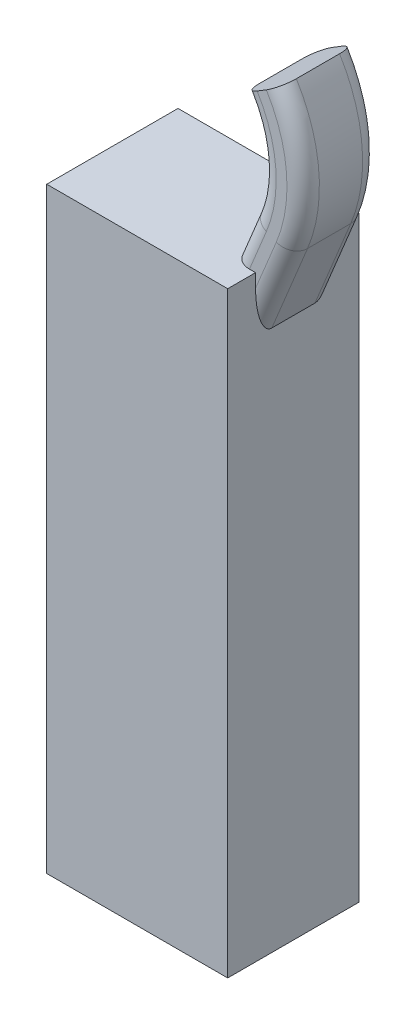
ISO-10303-21;
HEADER;
FILE_DESCRIPTION(('STEP AP214'),'2;1');
FILE_NAME('part.step','',(''),(''),'','','');
FILE_SCHEMA(('AUTOMOTIVE_DESIGN { 1 0 10303 214 1 1 1 1 }'));
ENDSEC;
DATA;
#1=APPLICATION_CONTEXT('core data for automotive mechanical design processes');
#2=APPLICATION_PROTOCOL_DEFINITION('international standard','automotive_design',2000,#1);
#3=PRODUCT_CONTEXT('',#1,'mechanical');
#4=PRODUCT('Part','Part','',(#3));
#5=PRODUCT_RELATED_PRODUCT_CATEGORY('part','',(#4));
#6=PRODUCT_DEFINITION_FORMATION('','',#4);
#7=PRODUCT_DEFINITION_CONTEXT('part definition',#1,'design');
#8=PRODUCT_DEFINITION('design','',#6,#7);
#9=PRODUCT_DEFINITION_SHAPE('','',#8);
#10=(LENGTH_UNIT() NAMED_UNIT(*) SI_UNIT(.MILLI.,.METRE.));
#11=(NAMED_UNIT(*) PLANE_ANGLE_UNIT() SI_UNIT($,.RADIAN.));
#12=(NAMED_UNIT(*) SI_UNIT($,.STERADIAN.) SOLID_ANGLE_UNIT());
#13=UNCERTAINTY_MEASURE_WITH_UNIT(LENGTH_MEASURE(1.E-05),#10,'distance_accuracy_value','');
#14=(GEOMETRIC_REPRESENTATION_CONTEXT(3) GLOBAL_UNCERTAINTY_ASSIGNED_CONTEXT((#13)) GLOBAL_UNIT_ASSIGNED_CONTEXT((#10,
#11,#12)) REPRESENTATION_CONTEXT('',''));
#15=CARTESIAN_POINT('',(0.,0.,0.));
#16=DIRECTION('',(0.,0.,1.));
#17=DIRECTION('',(1.,0.,0.));
#18=AXIS2_PLACEMENT_3D('',#15,#16,#17);
#19=CARTESIAN_POINT('',(16.75,-55.25,12.15));
#20=DIRECTION('',(-1.,0.,0.));
#21=DIRECTION('',(0.,0.,1.));
#22=AXIS2_PLACEMENT_3D('',#19,#20,#21);
#23=PLANE('',#22);
#24=DIRECTION('',(0.,0.,-1.));
#25=VECTOR('',#24,1.);
#26=CARTESIAN_POINT('',(16.75,44.8673503761289,12.15));
#27=LINE('',#26,#25);
#28=CARTESIAN_POINT('',(16.75,44.8673503761289,4.));
#29=VERTEX_POINT('',#28);
#30=CARTESIAN_POINT('',(16.75,44.8673503761289,-4.));
#31=VERTEX_POINT('',#30);
#32=EDGE_CURVE('E200',#29,#31,#27,.T.);
#33=ORIENTED_EDGE('',*,*,#32,.F.);
#34=CARTESIAN_POINT('',(16.75,52.7331085884756,4.));
#35=DIRECTION('',(-1.,0.,0.));
#36=DIRECTION('',(0.,-1.,0.));
#37=AXIS2_PLACEMENT_3D('',#34,#35,#36);
#38=ELLIPSE('',#37,7.86575821234668,3.);
#39=CARTESIAN_POINT('',(16.75,52.7331085884756,7.));
#40=VERTEX_POINT('',#39);
#41=EDGE_CURVE('E247',#29,#40,#38,.T.);
#42=ORIENTED_EDGE('',*,*,#41,.T.);
#43=DIRECTION('',(0.,1.,0.));
#44=VECTOR('',#43,1.);
#45=CARTESIAN_POINT('',(16.75,-55.25,7.));
#46=LINE('',#45,#44);
#47=CARTESIAN_POINT('',(16.75,55.25,7.));
#48=VERTEX_POINT('',#47);
#49=EDGE_CURVE('E186',#40,#48,#46,.T.);
#50=ORIENTED_EDGE('',*,*,#49,.T.);
#51=DIRECTION('',(0.,0.,-1.));
#52=VECTOR('',#51,1.);
#53=CARTESIAN_POINT('',(16.75,55.25,12.15));
#54=LINE('',#53,#52);
#55=CARTESIAN_POINT('',(16.75,55.25,12.15));
#56=VERTEX_POINT('',#55);
#57=EDGE_CURVE('E166',#56,#48,#54,.T.);
#58=ORIENTED_EDGE('',*,*,#57,.F.);
#59=DIRECTION('',(0.,1.,0.));
#60=VECTOR('',#59,1.);
#61=CARTESIAN_POINT('',(16.75,-55.25,12.15));
#62=LINE('',#61,#60);
#63=CARTESIAN_POINT('',(16.75,-55.25,12.15));
#64=VERTEX_POINT('',#63);
#65=EDGE_CURVE('E173',#64,#56,#62,.T.);
#66=ORIENTED_EDGE('',*,*,#65,.F.);
#67=DIRECTION('',(0.,0.,-1.));
#68=VECTOR('',#67,1.);
#69=CARTESIAN_POINT('',(16.75,-55.25,12.15));
#70=LINE('',#69,#68);
#71=CARTESIAN_POINT('',(16.75,-55.25,-12.15));
#72=VERTEX_POINT('',#71);
#73=EDGE_CURVE('E294',#64,#72,#70,.T.);
#74=ORIENTED_EDGE('',*,*,#73,.T.);
#75=DIRECTION('',(0.,1.,0.));
#76=VECTOR('',#75,1.);
#77=CARTESIAN_POINT('',(16.75,-55.25,-12.15));
#78=LINE('',#77,#76);
#79=CARTESIAN_POINT('',(16.75,55.25,-12.15));
#80=VERTEX_POINT('',#79);
#81=EDGE_CURVE('E290',#72,#80,#78,.T.);
#82=ORIENTED_EDGE('',*,*,#81,.T.);
#83=CARTESIAN_POINT('',(16.75,55.25,-7.));
#84=VERTEX_POINT('',#83);
#85=EDGE_CURVE('E188',#84,#80,#54,.T.);
#86=ORIENTED_EDGE('',*,*,#85,.F.);
#87=DIRECTION('',(0.,1.,0.));
#88=VECTOR('',#87,1.);
#89=CARTESIAN_POINT('',(16.75,-55.25,-7.));
#90=LINE('',#89,#88);
#91=CARTESIAN_POINT('',(16.75,52.7331085884756,-7.));
#92=VERTEX_POINT('',#91);
#93=EDGE_CURVE('E288',#92,#84,#90,.T.);
#94=ORIENTED_EDGE('',*,*,#93,.F.);
#95=CARTESIAN_POINT('',(16.75,52.7331085884756,-4.));
#96=DIRECTION('',(-1.,0.,0.));
#97=DIRECTION('',(0.,1.,0.));
#98=AXIS2_PLACEMENT_3D('',#95,#96,#97);
#99=ELLIPSE('',#98,7.86575821234668,3.);
#100=EDGE_CURVE('E245',#92,#31,#99,.T.);
#101=ORIENTED_EDGE('',*,*,#100,.T.);
#102=EDGE_LOOP('',(#33,#42,#50,#58,#66,#74,#82,#86,#94,#101));
#103=FACE_BOUND('',#102,.T.);
#104=ADVANCED_FACE('F39',(#103),#23,.F.);
#105=CARTESIAN_POINT('',(-16.75,55.25,12.15));
#106=DIRECTION('',(0.,-1.,0.));
#107=DIRECTION('',(0.,0.,-1.));
#108=AXIS2_PLACEMENT_3D('',#105,#106,#107);
#109=PLANE('',#108);
#110=ORIENTED_EDGE('',*,*,#57,.T.);
#111=DIRECTION('',(-1.,0.,0.));
#112=VECTOR('',#111,1.);
#113=CARTESIAN_POINT('',(-16.75,55.25,7.));
#114=LINE('',#113,#112);
#115=CARTESIAN_POINT('',(15.6248958293308,55.25,7.));
#116=VERTEX_POINT('',#115);
#117=EDGE_CURVE('E198',#48,#116,#114,.T.);
#118=ORIENTED_EDGE('',*,*,#117,.T.);
#119=CARTESIAN_POINT('',(15.6248958293308,55.25,4.));
#120=DIRECTION('',(0.,-1.,0.));
#121=DIRECTION('',(1.,0.,0.));
#122=AXIS2_PLACEMENT_3D('',#119,#120,#121);
#123=ELLIPSE('',#122,3.2453128288703,3.);
#124=CARTESIAN_POINT('',(12.3795830004605,55.25,4.));
#125=VERTEX_POINT('',#124);
#126=EDGE_CURVE('E11',#116,#125,#123,.T.);
#127=ORIENTED_EDGE('',*,*,#126,.T.);
#128=DIRECTION('',(0.,0.,-1.));
#129=VECTOR('',#128,1.);
#130=CARTESIAN_POINT('',(12.3795830004605,55.25,12.15));
#131=LINE('',#130,#129);
#132=CARTESIAN_POINT('',(12.3795830004605,55.25,-4.));
#133=VERTEX_POINT('',#132);
#134=EDGE_CURVE('E191',#125,#133,#131,.T.);
#135=ORIENTED_EDGE('',*,*,#134,.T.);
#136=CARTESIAN_POINT('',(15.6248958293308,55.25,-4.));
#137=DIRECTION('',(0.,-1.,0.));
#138=DIRECTION('',(-1.,0.,0.));
#139=AXIS2_PLACEMENT_3D('',#136,#137,#138);
#140=ELLIPSE('',#139,3.2453128288703,3.);
#141=CARTESIAN_POINT('',(15.6248958293308,55.25,-7.));
#142=VERTEX_POINT('',#141);
#143=EDGE_CURVE('E48',#133,#142,#140,.T.);
#144=ORIENTED_EDGE('',*,*,#143,.T.);
#145=DIRECTION('',(-1.,0.,0.));
#146=VECTOR('',#145,1.);
#147=CARTESIAN_POINT('',(-16.75,55.25,-7.));
#148=LINE('',#147,#146);
#149=EDGE_CURVE('E187',#84,#142,#148,.T.);
#150=ORIENTED_EDGE('',*,*,#149,.F.);
#151=ORIENTED_EDGE('',*,*,#85,.T.);
#152=DIRECTION('',(-1.,0.,0.));
#153=VECTOR('',#152,1.);
#154=CARTESIAN_POINT('',(-16.75,55.25,-12.15));
#155=LINE('',#154,#153);
#156=CARTESIAN_POINT('',(-16.75,55.25,-12.15));
#157=VERTEX_POINT('',#156);
#158=EDGE_CURVE('E297',#80,#157,#155,.T.);
#159=ORIENTED_EDGE('',*,*,#158,.T.);
#160=DIRECTION('',(0.,0.,-1.));
#161=VECTOR('',#160,1.);
#162=CARTESIAN_POINT('',(-16.75,55.25,12.15));
#163=LINE('',#162,#161);
#164=CARTESIAN_POINT('',(-16.75,55.25,12.15));
#165=VERTEX_POINT('',#164);
#166=EDGE_CURVE('E169',#165,#157,#163,.T.);
#167=ORIENTED_EDGE('',*,*,#166,.F.);
#168=DIRECTION('',(-1.,0.,0.));
#169=VECTOR('',#168,1.);
#170=CARTESIAN_POINT('',(-16.75,55.25,12.15));
#171=LINE('',#170,#169);
#172=EDGE_CURVE('E161',#56,#165,#171,.T.);
#173=ORIENTED_EDGE('',*,*,#172,.F.);
#174=EDGE_LOOP('',(#110,#118,#127,#135,#144,#150,#151,#159,#167,#173));
#175=FACE_BOUND('',#174,.T.);
#176=ADVANCED_FACE('F163',(#175),#109,.F.);
#177=CARTESIAN_POINT('',(-16.75,-55.25,12.15));
#178=DIRECTION('',(1.,0.,0.));
#179=DIRECTION('',(0.,0.,-1.));
#180=AXIS2_PLACEMENT_3D('',#177,#178,#179);
#181=PLANE('',#180);
#182=DIRECTION('',(0.,-1.,0.));
#183=VECTOR('',#182,1.);
#184=CARTESIAN_POINT('',(-16.75,-55.25,-12.15));
#185=LINE('',#184,#183);
#186=CARTESIAN_POINT('',(-16.75,-55.25,-12.15));
#187=VERTEX_POINT('',#186);
#188=EDGE_CURVE('E299',#157,#187,#185,.T.);
#189=ORIENTED_EDGE('',*,*,#188,.T.);
#190=DIRECTION('',(0.,0.,-1.));
#191=VECTOR('',#190,1.);
#192=CARTESIAN_POINT('',(-16.75,-55.25,12.15));
#193=LINE('',#192,#191);
#194=CARTESIAN_POINT('',(-16.75,-55.25,12.15));
#195=VERTEX_POINT('',#194);
#196=EDGE_CURVE('E302',#195,#187,#193,.T.);
#197=ORIENTED_EDGE('',*,*,#196,.F.);
#198=DIRECTION('',(0.,-1.,0.));
#199=VECTOR('',#198,1.);
#200=CARTESIAN_POINT('',(-16.75,-55.25,12.15));
#201=LINE('',#200,#199);
#202=EDGE_CURVE('E172',#165,#195,#201,.T.);
#203=ORIENTED_EDGE('',*,*,#202,.F.);
#204=ORIENTED_EDGE('',*,*,#166,.T.);
#205=EDGE_LOOP('',(#189,#197,#203,#204));
#206=FACE_BOUND('',#205,.T.);
#207=ADVANCED_FACE('F309',(#206),#181,.F.);
#208=CARTESIAN_POINT('',(-16.75,-55.25,12.15));
#209=DIRECTION('',(0.,1.,0.));
#210=DIRECTION('',(0.,0.,1.));
#211=AXIS2_PLACEMENT_3D('',#208,#209,#210);
#212=PLANE('',#211);
#213=DIRECTION('',(1.,0.,0.));
#214=VECTOR('',#213,1.);
#215=CARTESIAN_POINT('',(-16.75,-55.25,-12.15));
#216=LINE('',#215,#214);
#217=EDGE_CURVE('E182',#187,#72,#216,.T.);
#218=ORIENTED_EDGE('',*,*,#217,.T.);
#219=ORIENTED_EDGE('',*,*,#73,.F.);
#220=DIRECTION('',(1.,0.,0.));
#221=VECTOR('',#220,1.);
#222=CARTESIAN_POINT('',(-16.75,-55.25,12.15));
#223=LINE('',#222,#221);
#224=EDGE_CURVE('E178',#195,#64,#223,.T.);
#225=ORIENTED_EDGE('',*,*,#224,.F.);
#226=ORIENTED_EDGE('',*,*,#196,.T.);
#227=EDGE_LOOP('',(#218,#219,#225,#226));
#228=FACE_BOUND('',#227,.T.);
#229=ADVANCED_FACE('F314',(#228),#212,.F.);
#230=CARTESIAN_POINT('',(0.,0.,12.15));
#231=DIRECTION('',(0.,0.,-1.));
#232=DIRECTION('',(-1.,0.,0.));
#233=AXIS2_PLACEMENT_3D('',#230,#231,#232);
#234=PLANE('',#233);
#235=ORIENTED_EDGE('',*,*,#65,.T.);
#236=ORIENTED_EDGE('',*,*,#172,.T.);
#237=ORIENTED_EDGE('',*,*,#202,.T.);
#238=ORIENTED_EDGE('',*,*,#224,.T.);
#239=EDGE_LOOP('',(#235,#236,#237,#238));
#240=FACE_BOUND('',#239,.T.);
#241=ADVANCED_FACE('F176',(#240),#234,.F.);
#242=CARTESIAN_POINT('',(0.,0.,-12.15));
#243=DIRECTION('',(0.,0.,-1.));
#244=DIRECTION('',(-1.,0.,0.));
#245=AXIS2_PLACEMENT_3D('',#242,#243,#244);
#246=PLANE('',#245);
#247=ORIENTED_EDGE('',*,*,#81,.F.);
#248=ORIENTED_EDGE('',*,*,#217,.F.);
#249=ORIENTED_EDGE('',*,*,#188,.F.);
#250=ORIENTED_EDGE('',*,*,#158,.F.);
#251=EDGE_LOOP('',(#247,#248,#249,#250));
#252=FACE_BOUND('',#251,.T.);
#253=ADVANCED_FACE('F313',(#252),#246,.T.);
#254=CARTESIAN_POINT('',(14.6147683773044,39.6921279685785,7.));
#255=DIRECTION('',(-0.924410113352401,0.381399976837704,0.));
#256=DIRECTION('',(-0.381399976837704,-0.924410113352401,0.));
#257=AXIS2_PLACEMENT_3D('',#254,#255,#256);
#258=PLANE('',#257);
#259=ORIENTED_EDGE('',*,*,#32,.T.);
#260=DIRECTION('',(0.381399976837704,0.924410113352401,0.));
#261=VECTOR('',#260,1.);
#262=CARTESIAN_POINT('',(14.6147683773044,39.6921279685785,-4.));
#263=LINE('',#262,#261);
#264=CARTESIAN_POINT('',(23.3781771869614,60.9322544055439,-4.));
#265=VERTEX_POINT('',#264);
#266=EDGE_CURVE('E205',#31,#265,#263,.T.);
#267=ORIENTED_EDGE('',*,*,#266,.T.);
#268=DIRECTION('',(0.,0.,-1.));
#269=VECTOR('',#268,1.);
#270=CARTESIAN_POINT('',(23.3781771869614,60.9322544055439,7.));
#271=LINE('',#270,#269);
#272=CARTESIAN_POINT('',(23.3781771869614,60.9322544055439,4.));
#273=VERTEX_POINT('',#272);
#274=EDGE_CURVE('E277',#273,#265,#271,.T.);
#275=ORIENTED_EDGE('',*,*,#274,.F.);
#276=DIRECTION('',(0.381399976837704,0.924410113352401,0.));
#277=VECTOR('',#276,1.);
#278=CARTESIAN_POINT('',(16.75,44.8673503761289,4.));
#279=LINE('',#278,#277);
#280=EDGE_CURVE('E203',#273,#29,#279,.F.);
#281=ORIENTED_EDGE('',*,*,#280,.T.);
#282=EDGE_LOOP('',(#259,#267,#275,#281));
#283=FACE_BOUND('',#282,.T.);
#284=ADVANCED_FACE('F345',(#283),#258,.F.);
#285=CARTESIAN_POINT('',(7.21948747048516,42.7433277832802,7.));
#286=DIRECTION('',(-0.924410113352401,0.381399976837704,0.));
#287=DIRECTION('',(-0.381399976837704,-0.924410113352401,0.));
#288=AXIS2_PLACEMENT_3D('',#285,#286,#287);
#289=PLANE('',#288);
#290=DIRECTION('',(0.,0.,-1.));
#291=VECTOR('',#290,1.);
#292=CARTESIAN_POINT('',(15.9828962801422,63.9834542202455,7.));
#293=LINE('',#292,#291);
#294=CARTESIAN_POINT('',(15.9828962801422,63.9834542202455,4.));
#295=VERTEX_POINT('',#294);
#296=CARTESIAN_POINT('',(15.9828962801422,63.9834542202455,-4.));
#297=VERTEX_POINT('',#296);
#298=EDGE_CURVE('E273',#295,#297,#293,.T.);
#299=ORIENTED_EDGE('',*,*,#298,.T.);
#300=DIRECTION('',(0.381399976837704,0.924410113352401,0.));
#301=VECTOR('',#300,1.);
#302=CARTESIAN_POINT('',(12.3795830004605,55.25,-4.));
#303=LINE('',#302,#301);
#304=EDGE_CURVE('E229',#297,#133,#303,.F.);
#305=ORIENTED_EDGE('',*,*,#304,.T.);
#306=ORIENTED_EDGE('',*,*,#134,.F.);
#307=DIRECTION('',(0.381399976837704,0.924410113352401,0.));
#308=VECTOR('',#307,1.);
#309=CARTESIAN_POINT('',(7.21948747048516,42.7433277832802,4.));
#310=LINE('',#309,#308);
#311=EDGE_CURVE('E226',#125,#295,#310,.T.);
#312=ORIENTED_EDGE('',*,*,#311,.T.);
#313=EDGE_LOOP('',(#299,#305,#306,#312));
#314=FACE_BOUND('',#313,.T.);
#315=ADVANCED_FACE('F272',(#314),#289,.T.);
#316=CARTESIAN_POINT('',(-3.42833912785645,71.9922856123569,7.));
#317=DIRECTION('',(0.,0.,1.));
#318=DIRECTION('',(1.,0.,0.));
#319=AXIS2_PLACEMENT_3D('',#316,#317,#318);
#320=PLANE('',#319);
#321=ORIENTED_EDGE('',*,*,#49,.F.);
#322=DIRECTION('',(0.381399976837704,0.924410113352401,0.));
#323=VECTOR('',#322,1.);
#324=CARTESIAN_POINT('',(20.6049468469042,62.076454336057,7.));
#325=LINE('',#324,#323);
#326=CARTESIAN_POINT('',(20.6049468469042,62.076454336057,7.));
#327=VERTEX_POINT('',#326);
#328=EDGE_CURVE('E223',#40,#327,#325,.T.);
#329=ORIENTED_EDGE('',*,*,#328,.T.);
#330=CARTESIAN_POINT('',(-3.42833912785645,71.9922856123569,7.));
#331=DIRECTION('',(0.,0.,1.));
#332=DIRECTION('',(1.,0.,0.));
#333=AXIS2_PLACEMENT_3D('',#330,#331,#332);
#334=CIRCLE('',#333,25.9985104312665);
#335=CARTESIAN_POINT('',(18.7512588368959,85.5565024628288,7.));
#336=VERTEX_POINT('',#335);
#337=EDGE_CURVE('E221',#327,#336,#334,.T.);
#338=ORIENTED_EDGE('',*,*,#337,.T.);
#339=DIRECTION('',(0.853110335816723,0.521730538614214,0.));
#340=VECTOR('',#339,1.);
#341=CARTESIAN_POINT('',(14.4857071578123,82.9478497697577,7.));
#342=LINE('',#341,#340);
#343=CARTESIAN_POINT('',(17.0450381652625,84.5130413856004,7.));
#344=VERTEX_POINT('',#343);
#345=EDGE_CURVE('E282',#344,#336,#342,.T.);
#346=ORIENTED_EDGE('',*,*,#345,.F.);
#347=CARTESIAN_POINT('',(-3.42833912785645,71.9922856123569,7.));
#348=DIRECTION('',(0.,0.,1.));
#349=DIRECTION('',(1.,0.,0.));
#350=AXIS2_PLACEMENT_3D('',#347,#348,#349);
#351=CIRCLE('',#350,23.9985104312665);
#352=CARTESIAN_POINT('',(18.7561266201994,62.8392542897324,7.));
#353=VERTEX_POINT('',#352);
#354=EDGE_CURVE('E217',#344,#353,#351,.F.);
#355=ORIENTED_EDGE('',*,*,#354,.T.);
#356=DIRECTION('',(0.381399976837704,0.924410113352401,0.));
#357=VECTOR('',#356,1.);
#358=CARTESIAN_POINT('',(18.7561266201994,62.8392542897324,7.));
#359=LINE('',#358,#357);
#360=EDGE_CURVE('E219',#353,#116,#359,.F.);
#361=ORIENTED_EDGE('',*,*,#360,.T.);
#362=ORIENTED_EDGE('',*,*,#117,.F.);
#363=EDGE_LOOP('',(#321,#329,#338,#346,#355,#361,#362));
#364=FACE_BOUND('',#363,.T.);
#365=ADVANCED_FACE('F351',(#364),#320,.T.);
#366=CARTESIAN_POINT('',(-3.42833912785645,71.9922856123569,-7.));
#367=DIRECTION('',(0.,0.,1.));
#368=DIRECTION('',(1.,0.,0.));
#369=AXIS2_PLACEMENT_3D('',#366,#367,#368);
#370=PLANE('',#369);
#371=CARTESIAN_POINT('',(-3.42833912785645,71.9922856123569,-7.));
#372=DIRECTION('',(0.,0.,1.));
#373=DIRECTION('',(1.,0.,0.));
#374=AXIS2_PLACEMENT_3D('',#371,#372,#373);
#375=CIRCLE('',#374,25.9985104312665);
#376=CARTESIAN_POINT('',(18.7512588368959,85.5565024628288,-7.));
#377=VERTEX_POINT('',#376);
#378=CARTESIAN_POINT('',(20.6049468469042,62.076454336057,-7.));
#379=VERTEX_POINT('',#378);
#380=EDGE_CURVE('E213',#377,#379,#375,.F.);
#381=ORIENTED_EDGE('',*,*,#380,.T.);
#382=DIRECTION('',(0.381399976837704,0.924410113352401,0.));
#383=VECTOR('',#382,1.);
#384=CARTESIAN_POINT('',(20.6049468469042,62.076454336057,-7.));
#385=LINE('',#384,#383);
#386=EDGE_CURVE('E215',#379,#92,#385,.F.);
#387=ORIENTED_EDGE('',*,*,#386,.T.);
#388=ORIENTED_EDGE('',*,*,#93,.T.);
#389=ORIENTED_EDGE('',*,*,#149,.T.);
#390=DIRECTION('',(0.381399976837704,0.924410113352401,0.));
#391=VECTOR('',#390,1.);
#392=CARTESIAN_POINT('',(18.7561266201994,62.8392542897324,-7.));
#393=LINE('',#392,#391);
#394=CARTESIAN_POINT('',(18.7561266201994,62.8392542897324,-7.));
#395=VERTEX_POINT('',#394);
#396=EDGE_CURVE('E210',#142,#395,#393,.T.);
#397=ORIENTED_EDGE('',*,*,#396,.T.);
#398=CARTESIAN_POINT('',(-3.42833912785645,71.9922856123569,-7.));
#399=DIRECTION('',(0.,0.,1.));
#400=DIRECTION('',(1.,0.,0.));
#401=AXIS2_PLACEMENT_3D('',#398,#399,#400);
#402=CIRCLE('',#401,23.9985104312665);
#403=CARTESIAN_POINT('',(17.0450381652625,84.5130413856004,-7.));
#404=VERTEX_POINT('',#403);
#405=EDGE_CURVE('E208',#395,#404,#402,.T.);
#406=ORIENTED_EDGE('',*,*,#405,.T.);
#407=DIRECTION('',(0.853110335816723,0.521730538614214,0.));
#408=VECTOR('',#407,1.);
#409=CARTESIAN_POINT('',(14.4857071578123,82.9478497697577,-7.));
#410=LINE('',#409,#408);
#411=EDGE_CURVE('E252',#404,#377,#410,.T.);
#412=ORIENTED_EDGE('',*,*,#411,.T.);
#413=EDGE_LOOP('',(#381,#387,#388,#389,#397,#406,#412));
#414=FACE_BOUND('',#413,.T.);
#415=ADVANCED_FACE('F321',(#414),#370,.F.);
#416=CARTESIAN_POINT('',(-3.42833912785645,71.9922856123569,7.));
#417=DIRECTION('',(0.,0.,-1.));
#418=DIRECTION('',(-1.,0.,0.));
#419=AXIS2_PLACEMENT_3D('',#416,#417,#418);
#420=CYLINDRICAL_SURFACE('',#419,28.9985104312665);
#421=ORIENTED_EDGE('',*,*,#274,.T.);
#422=CARTESIAN_POINT('',(-3.42833912785645,71.9922856123569,-4.));
#423=DIRECTION('',(0.,0.,1.));
#424=DIRECTION('',(1.,0.,0.));
#425=AXIS2_PLACEMENT_3D('',#422,#423,#424);
#426=CIRCLE('',#425,28.9985104312665);
#427=CARTESIAN_POINT('',(21.3105898443461,87.1216940786714,-4.));
#428=VERTEX_POINT('',#427);
#429=EDGE_CURVE('E233',#265,#428,#426,.T.);
#430=ORIENTED_EDGE('',*,*,#429,.T.);
#431=DIRECTION('',(0.,0.,-1.));
#432=VECTOR('',#431,1.);
#433=CARTESIAN_POINT('',(21.3105898443461,87.1216940786714,7.));
#434=LINE('',#433,#432);
#435=CARTESIAN_POINT('',(21.3105898443461,87.1216940786714,4.));
#436=VERTEX_POINT('',#435);
#437=EDGE_CURVE('E279',#436,#428,#434,.T.);
#438=ORIENTED_EDGE('',*,*,#437,.F.);
#439=CARTESIAN_POINT('',(-3.42833912785645,71.9922856123569,4.));
#440=DIRECTION('',(0.,0.,1.));
#441=DIRECTION('',(1.,0.,0.));
#442=AXIS2_PLACEMENT_3D('',#439,#440,#441);
#443=CIRCLE('',#442,28.9985104312665);
#444=EDGE_CURVE('E231',#436,#273,#443,.F.);
#445=ORIENTED_EDGE('',*,*,#444,.T.);
#446=EDGE_LOOP('',(#421,#430,#438,#445));
#447=FACE_BOUND('',#446,.T.);
#448=ADVANCED_FACE('F342',(#447),#420,.T.);
#449=CARTESIAN_POINT('',(14.4857071578123,82.9478497697577,7.));
#450=DIRECTION('',(-0.521730538614214,0.853110335816723,0.));
#451=DIRECTION('',(-0.853110335816723,-0.521730538614214,0.));
#452=AXIS2_PLACEMENT_3D('',#449,#450,#451);
#453=PLANE('',#452);
#454=ORIENTED_EDGE('',*,*,#437,.T.);
#455=CARTESIAN_POINT('',(18.7512588368959,85.5565024628288,-4.));
#456=DIRECTION('',(-0.521730538614214,0.853110335816723,0.));
#457=DIRECTION('',(-0.853110335816723,-0.521730538614214,0.));
#458=AXIS2_PLACEMENT_3D('',#455,#456,#457);
#459=CIRCLE('',#458,3.);
#460=EDGE_CURVE('E240',#428,#377,#459,.T.);
#461=ORIENTED_EDGE('',*,*,#460,.T.);
#462=ORIENTED_EDGE('',*,*,#411,.F.);
#463=CARTESIAN_POINT('',(17.0450381652625,84.5130413856004,-4.));
#464=DIRECTION('',(-0.521730538614214,0.853110335816723,0.));
#465=DIRECTION('',(-0.853110335816723,-0.521730538614214,0.));
#466=AXIS2_PLACEMENT_3D('',#463,#464,#465);
#467=CIRCLE('',#466,3.);
#468=CARTESIAN_POINT('',(14.4857071578123,82.9478497697577,-4.));
#469=VERTEX_POINT('',#468);
#470=EDGE_CURVE('E56',#404,#469,#467,.T.);
#471=ORIENTED_EDGE('',*,*,#470,.T.);
#472=DIRECTION('',(0.,0.,-1.));
#473=VECTOR('',#472,1.);
#474=CARTESIAN_POINT('',(14.4857071578123,82.9478497697577,7.));
#475=LINE('',#474,#473);
#476=CARTESIAN_POINT('',(14.4857071578123,82.9478497697577,4.));
#477=VERTEX_POINT('',#476);
#478=EDGE_CURVE('E276',#477,#469,#475,.T.);
#479=ORIENTED_EDGE('',*,*,#478,.F.);
#480=CARTESIAN_POINT('',(17.0450381652625,84.5130413856004,4.));
#481=DIRECTION('',(-0.521730538614214,0.853110335816723,0.));
#482=DIRECTION('',(-0.853110335816723,-0.521730538614214,0.));
#483=AXIS2_PLACEMENT_3D('',#480,#481,#482);
#484=CIRCLE('',#483,3.);
#485=EDGE_CURVE('E235',#477,#344,#484,.T.);
#486=ORIENTED_EDGE('',*,*,#485,.T.);
#487=ORIENTED_EDGE('',*,*,#345,.T.);
#488=CARTESIAN_POINT('',(18.7512588368959,85.5565024628288,4.));
#489=DIRECTION('',(-0.521730538614214,0.853110335816723,0.));
#490=DIRECTION('',(-0.853110335816723,-0.521730538614214,0.));
#491=AXIS2_PLACEMENT_3D('',#488,#489,#490);
#492=CIRCLE('',#491,3.);
#493=EDGE_CURVE('E238',#336,#436,#492,.T.);
#494=ORIENTED_EDGE('',*,*,#493,.T.);
#495=EDGE_LOOP('',(#454,#461,#462,#471,#479,#486,#487,#494));
#496=FACE_BOUND('',#495,.T.);
#497=ADVANCED_FACE('F327',(#496),#453,.T.);
#498=CARTESIAN_POINT('',(-3.42833912785645,71.9922856123569,7.));
#499=DIRECTION('',(0.,0.,-1.));
#500=DIRECTION('',(-1.,0.,0.));
#501=AXIS2_PLACEMENT_3D('',#498,#499,#500);
#502=CYLINDRICAL_SURFACE('',#501,20.9985104312665);
#503=ORIENTED_EDGE('',*,*,#478,.T.);
#504=CARTESIAN_POINT('',(-3.42833912785645,71.9922856123569,-4.));
#505=DIRECTION('',(0.,0.,1.));
#506=DIRECTION('',(1.,0.,0.));
#507=AXIS2_PLACEMENT_3D('',#504,#505,#506);
#508=CIRCLE('',#507,20.9985104312665);
#509=EDGE_CURVE('E243',#469,#297,#508,.F.);
#510=ORIENTED_EDGE('',*,*,#509,.T.);
#511=ORIENTED_EDGE('',*,*,#298,.F.);
#512=CARTESIAN_POINT('',(-3.42833912785645,71.9922856123569,4.));
#513=DIRECTION('',(0.,0.,1.));
#514=DIRECTION('',(1.,0.,0.));
#515=AXIS2_PLACEMENT_3D('',#512,#513,#514);
#516=CIRCLE('',#515,20.9985104312665);
#517=EDGE_CURVE('E63',#295,#477,#516,.T.);
#518=ORIENTED_EDGE('',*,*,#517,.T.);
#519=EDGE_LOOP('',(#503,#510,#511,#518));
#520=FACE_BOUND('',#519,.T.);
#521=ADVANCED_FACE('F274',(#520),#502,.F.);
#522=CARTESIAN_POINT('',(-3.42833912785645,71.9922856123569,-4.));
#523=DIRECTION('',(0.,0.,1.));
#524=DIRECTION('',(1.,0.,0.));
#525=AXIS2_PLACEMENT_3D('',#522,#523,#524);
#526=TOROIDAL_SURFACE('',#525,25.9985104312665,3.);
#527=ORIENTED_EDGE('',*,*,#460,.F.);
#528=ORIENTED_EDGE('',*,*,#429,.F.);
#529=CARTESIAN_POINT('',(20.6049468469042,62.076454336057,-4.));
#530=DIRECTION('',(-0.381399976837703,-0.924410113352402,0.));
#531=DIRECTION('',(0.924410113352402,-0.381399976837703,0.));
#532=AXIS2_PLACEMENT_3D('',#529,#530,#531);
#533=CIRCLE('',#532,3.);
#534=EDGE_CURVE('E250',#379,#265,#533,.T.);
#535=ORIENTED_EDGE('',*,*,#534,.F.);
#536=ORIENTED_EDGE('',*,*,#380,.F.);
#537=EDGE_LOOP('',(#527,#528,#535,#536));
#538=FACE_BOUND('',#537,.T.);
#539=ADVANCED_FACE('F372',(#538),#526,.T.);
#540=CARTESIAN_POINT('',(11.8415380372472,40.8363278990916,-4.));
#541=DIRECTION('',(0.381399976837704,0.924410113352401,0.));
#542=DIRECTION('',(-0.924410113352401,0.381399976837704,0.));
#543=AXIS2_PLACEMENT_3D('',#540,#541,#542);
#544=CYLINDRICAL_SURFACE('',#543,3.);
#545=ORIENTED_EDGE('',*,*,#100,.F.);
#546=ORIENTED_EDGE('',*,*,#386,.F.);
#547=ORIENTED_EDGE('',*,*,#534,.T.);
#548=ORIENTED_EDGE('',*,*,#266,.F.);
#549=EDGE_LOOP('',(#545,#546,#547,#548));
#550=FACE_BOUND('',#549,.T.);
#551=ADVANCED_FACE('F369',(#550),#544,.T.);
#552=CARTESIAN_POINT('',(-3.42833912785645,71.9922856123569,4.));
#553=DIRECTION('',(0.,0.,1.));
#554=DIRECTION('',(1.,0.,0.));
#555=AXIS2_PLACEMENT_3D('',#552,#553,#554);
#556=TOROIDAL_SURFACE('',#555,25.9985104312665,3.);
#557=ORIENTED_EDGE('',*,*,#493,.F.);
#558=ORIENTED_EDGE('',*,*,#337,.F.);
#559=CARTESIAN_POINT('',(20.6049468469042,62.076454336057,4.));
#560=DIRECTION('',(-0.381399976837703,-0.924410113352401,0.));
#561=DIRECTION('',(0.924410113352401,-0.381399976837703,0.));
#562=AXIS2_PLACEMENT_3D('',#559,#560,#561);
#563=CIRCLE('',#562,3.);
#564=EDGE_CURVE('E253',#273,#327,#563,.T.);
#565=ORIENTED_EDGE('',*,*,#564,.F.);
#566=ORIENTED_EDGE('',*,*,#444,.F.);
#567=EDGE_LOOP('',(#557,#558,#565,#566));
#568=FACE_BOUND('',#567,.T.);
#569=ADVANCED_FACE('F338',(#568),#556,.T.);
#570=CARTESIAN_POINT('',(20.6049468469042,62.076454336057,4.));
#571=DIRECTION('',(-0.381399976837704,-0.924410113352401,0.));
#572=DIRECTION('',(0.924410113352401,-0.381399976837704,0.));
#573=AXIS2_PLACEMENT_3D('',#570,#571,#572);
#574=CYLINDRICAL_SURFACE('',#573,3.);
#575=ORIENTED_EDGE('',*,*,#41,.F.);
#576=ORIENTED_EDGE('',*,*,#280,.F.);
#577=ORIENTED_EDGE('',*,*,#564,.T.);
#578=ORIENTED_EDGE('',*,*,#328,.F.);
#579=EDGE_LOOP('',(#575,#576,#577,#578));
#580=FACE_BOUND('',#579,.T.);
#581=ADVANCED_FACE('F349',(#580),#574,.T.);
#582=CARTESIAN_POINT('',(-3.42833912785645,71.9922856123569,-4.));
#583=DIRECTION('',(0.,0.,1.));
#584=DIRECTION('',(1.,0.,0.));
#585=AXIS2_PLACEMENT_3D('',#582,#583,#584);
#586=TOROIDAL_SURFACE('',#585,23.9985104312665,3.);
#587=ORIENTED_EDGE('',*,*,#470,.F.);
#588=ORIENTED_EDGE('',*,*,#405,.F.);
#589=CARTESIAN_POINT('',(18.7561266201994,62.8392542897324,-4.));
#590=DIRECTION('',(-0.381399976837703,-0.924410113352401,0.));
#591=DIRECTION('',(0.924410113352401,-0.381399976837703,0.));
#592=AXIS2_PLACEMENT_3D('',#589,#590,#591);
#593=CIRCLE('',#592,3.);
#594=EDGE_CURVE('E254',#297,#395,#593,.T.);
#595=ORIENTED_EDGE('',*,*,#594,.F.);
#596=ORIENTED_EDGE('',*,*,#509,.F.);
#597=EDGE_LOOP('',(#587,#588,#595,#596));
#598=FACE_BOUND('',#597,.T.);
#599=ADVANCED_FACE('F324',(#598),#586,.T.);
#600=CARTESIAN_POINT('',(18.7561266201994,62.8392542897324,-4.));
#601=DIRECTION('',(-0.381399976837704,-0.924410113352401,0.));
#602=DIRECTION('',(0.924410113352401,-0.381399976837704,0.));
#603=AXIS2_PLACEMENT_3D('',#600,#601,#602);
#604=CYLINDRICAL_SURFACE('',#603,3.);
#605=ORIENTED_EDGE('',*,*,#143,.F.);
#606=ORIENTED_EDGE('',*,*,#304,.F.);
#607=ORIENTED_EDGE('',*,*,#594,.T.);
#608=ORIENTED_EDGE('',*,*,#396,.F.);
#609=EDGE_LOOP('',(#605,#606,#607,#608));
#610=FACE_BOUND('',#609,.T.);
#611=ADVANCED_FACE('F322',(#610),#604,.T.);
#612=CARTESIAN_POINT('',(-3.42833912785645,71.9922856123569,4.));
#613=DIRECTION('',(0.,0.,1.));
#614=DIRECTION('',(1.,0.,0.));
#615=AXIS2_PLACEMENT_3D('',#612,#613,#614);
#616=TOROIDAL_SURFACE('',#615,23.9985104312665,3.);
#617=ORIENTED_EDGE('',*,*,#485,.F.);
#618=ORIENTED_EDGE('',*,*,#517,.F.);
#619=CARTESIAN_POINT('',(18.7561266201994,62.8392542897324,4.));
#620=DIRECTION('',(-0.381399976837703,-0.924410113352401,0.));
#621=DIRECTION('',(0.924410113352401,-0.381399976837703,0.));
#622=AXIS2_PLACEMENT_3D('',#619,#620,#621);
#623=CIRCLE('',#622,3.);
#624=EDGE_CURVE('E43',#353,#295,#623,.T.);
#625=ORIENTED_EDGE('',*,*,#624,.F.);
#626=ORIENTED_EDGE('',*,*,#354,.F.);
#627=EDGE_LOOP('',(#617,#618,#625,#626));
#628=FACE_BOUND('',#627,.T.);
#629=ADVANCED_FACE('F41',(#628),#616,.T.);
#630=CARTESIAN_POINT('',(9.99271781054236,41.599127852767,4.));
#631=DIRECTION('',(0.381399976837704,0.924410113352401,0.));
#632=DIRECTION('',(-0.924410113352401,0.381399976837704,0.));
#633=AXIS2_PLACEMENT_3D('',#630,#631,#632);
#634=CYLINDRICAL_SURFACE('',#633,3.);
#635=ORIENTED_EDGE('',*,*,#126,.F.);
#636=ORIENTED_EDGE('',*,*,#360,.F.);
#637=ORIENTED_EDGE('',*,*,#624,.T.);
#638=ORIENTED_EDGE('',*,*,#311,.F.);
#639=EDGE_LOOP('',(#635,#636,#637,#638));
#640=FACE_BOUND('',#639,.T.);
#641=ADVANCED_FACE('F265',(#640),#634,.T.);
#642=CLOSED_SHELL('',(#104,#176,#207,#229,#241,#253,#284,#315,#365,#415,#448,#497,#521,#539,
#551,#569,#581,#599,#611,#629,#641));
#643=MANIFOLD_SOLID_BREP('B2',#642);
#644=ADVANCED_BREP_SHAPE_REPRESENTATION('',(#18,#643),#14);
#645=SHAPE_DEFINITION_REPRESENTATION(#9,#644);
ENDSEC;
END-ISO-10303-21;
